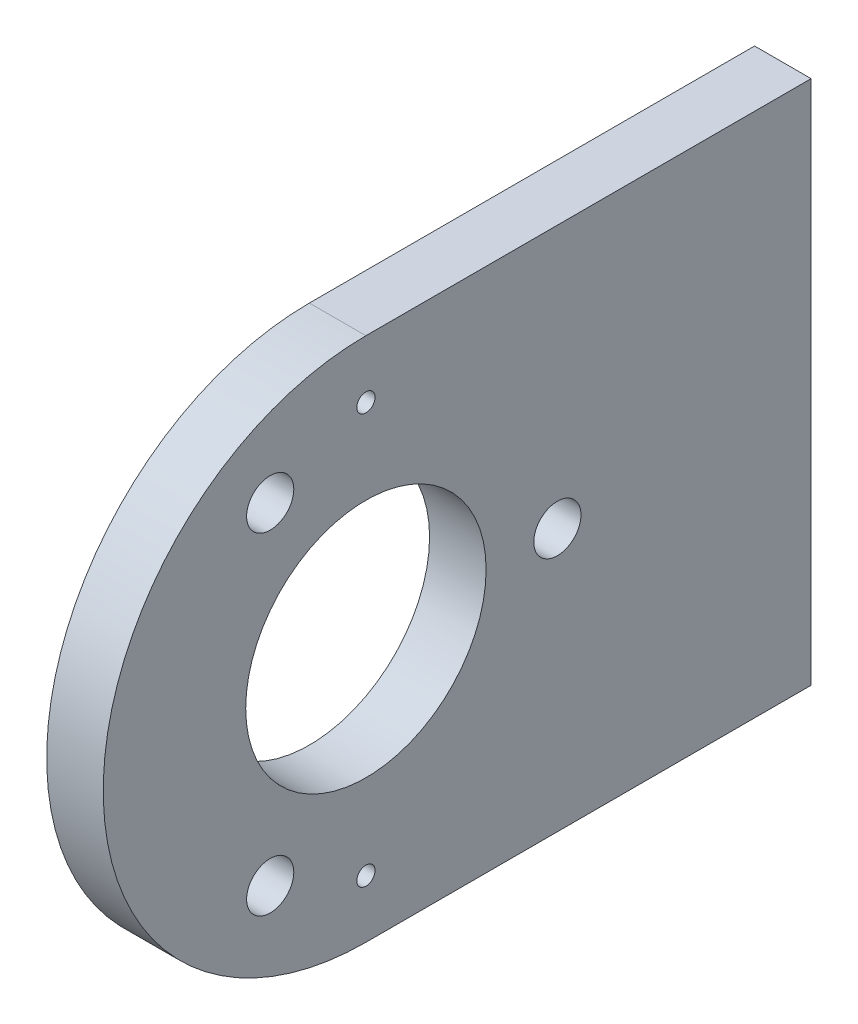
ISO-10303-21;
HEADER;
FILE_DESCRIPTION(('STEP AP214'),'2;1');
FILE_NAME('part.step','',(''),(''),'','','');
FILE_SCHEMA(('AUTOMOTIVE_DESIGN { 1 0 10303 214 1 1 1 1 }'));
ENDSEC;
DATA;
#1=APPLICATION_CONTEXT('core data for automotive mechanical design processes');
#2=APPLICATION_PROTOCOL_DEFINITION('international standard','automotive_design',2000,#1);
#3=PRODUCT_CONTEXT('',#1,'mechanical');
#4=PRODUCT('Part','Part','',(#3));
#5=PRODUCT_RELATED_PRODUCT_CATEGORY('part','',(#4));
#6=PRODUCT_DEFINITION_FORMATION('','',#4);
#7=PRODUCT_DEFINITION_CONTEXT('part definition',#1,'design');
#8=PRODUCT_DEFINITION('design','',#6,#7);
#9=PRODUCT_DEFINITION_SHAPE('','',#8);
#10=(LENGTH_UNIT() NAMED_UNIT(*) SI_UNIT(.MILLI.,.METRE.));
#11=(NAMED_UNIT(*) PLANE_ANGLE_UNIT() SI_UNIT($,.RADIAN.));
#12=(NAMED_UNIT(*) SI_UNIT($,.STERADIAN.) SOLID_ANGLE_UNIT());
#13=UNCERTAINTY_MEASURE_WITH_UNIT(LENGTH_MEASURE(1.E-05),#10,'distance_accuracy_value','');
#14=(GEOMETRIC_REPRESENTATION_CONTEXT(3) GLOBAL_UNCERTAINTY_ASSIGNED_CONTEXT((#13)) GLOBAL_UNIT_ASSIGNED_CONTEXT((#10,
#11,#12)) REPRESENTATION_CONTEXT('',''));
#15=CARTESIAN_POINT('',(0.,0.,0.));
#16=DIRECTION('',(0.,0.,1.));
#17=DIRECTION('',(1.,0.,0.));
#18=AXIS2_PLACEMENT_3D('',#15,#16,#17);
#19=CARTESIAN_POINT('',(6.35,29.5,0.));
#20=DIRECTION('',(0.,1.,0.));
#21=DIRECTION('',(0.,0.,1.));
#22=AXIS2_PLACEMENT_3D('',#19,#20,#21);
#23=PLANE('',#22);
#24=DIRECTION('',(0.,0.,-1.));
#25=VECTOR('',#24,1.);
#26=CARTESIAN_POINT('',(0.,29.5,0.));
#27=LINE('',#26,#25);
#28=CARTESIAN_POINT('',(0.,29.5,50.));
#29=VERTEX_POINT('',#28);
#30=CARTESIAN_POINT('',(0.,29.5,0.));
#31=VERTEX_POINT('',#30);
#32=EDGE_CURVE('E186',#29,#31,#27,.T.);
#33=ORIENTED_EDGE('',*,*,#32,.F.);
#34=DIRECTION('',(-1.,0.,0.));
#35=VECTOR('',#34,1.);
#36=CARTESIAN_POINT('',(6.35,29.5,50.));
#37=LINE('',#36,#35);
#38=CARTESIAN_POINT('',(6.35,29.5,50.));
#39=VERTEX_POINT('',#38);
#40=EDGE_CURVE('E11',#39,#29,#37,.T.);
#41=ORIENTED_EDGE('',*,*,#40,.F.);
#42=DIRECTION('',(0.,0.,-1.));
#43=VECTOR('',#42,1.);
#44=CARTESIAN_POINT('',(6.35,29.5,0.));
#45=LINE('',#44,#43);
#46=CARTESIAN_POINT('',(6.35,29.5,0.));
#47=VERTEX_POINT('',#46);
#48=EDGE_CURVE('E166',#39,#47,#45,.T.);
#49=ORIENTED_EDGE('',*,*,#48,.T.);
#50=DIRECTION('',(-1.,0.,0.));
#51=VECTOR('',#50,1.);
#52=CARTESIAN_POINT('',(6.35,29.5,0.));
#53=LINE('',#52,#51);
#54=EDGE_CURVE('E61',#47,#31,#53,.T.);
#55=ORIENTED_EDGE('',*,*,#54,.T.);
#56=EDGE_LOOP('',(#33,#41,#49,#55));
#57=FACE_BOUND('',#56,.T.);
#58=ADVANCED_FACE('F44',(#57),#23,.T.);
#59=CARTESIAN_POINT('',(6.35,0.,50.));
#60=DIRECTION('',(-1.,0.,0.));
#61=DIRECTION('',(0.,0.,1.));
#62=AXIS2_PLACEMENT_3D('',#59,#60,#61);
#63=CYLINDRICAL_SURFACE('',#62,29.5);
#64=CARTESIAN_POINT('',(0.,0.,50.));
#65=DIRECTION('',(1.,0.,0.));
#66=DIRECTION('',(0.,0.,-1.));
#67=AXIS2_PLACEMENT_3D('',#64,#65,#66);
#68=CIRCLE('',#67,29.5);
#69=CARTESIAN_POINT('',(0.,-29.5,50.));
#70=VERTEX_POINT('',#69);
#71=EDGE_CURVE('E188',#29,#70,#68,.T.);
#72=ORIENTED_EDGE('',*,*,#71,.T.);
#73=DIRECTION('',(-1.,0.,0.));
#74=VECTOR('',#73,1.);
#75=CARTESIAN_POINT('',(6.35,-29.5,50.));
#76=LINE('',#75,#74);
#77=CARTESIAN_POINT('',(6.35,-29.5,50.));
#78=VERTEX_POINT('',#77);
#79=EDGE_CURVE('E53',#78,#70,#76,.T.);
#80=ORIENTED_EDGE('',*,*,#79,.F.);
#81=CARTESIAN_POINT('',(6.35,0.,50.));
#82=DIRECTION('',(1.,0.,0.));
#83=DIRECTION('',(0.,0.,-1.));
#84=AXIS2_PLACEMENT_3D('',#81,#82,#83);
#85=CIRCLE('',#84,29.5);
#86=EDGE_CURVE('E168',#39,#78,#85,.T.);
#87=ORIENTED_EDGE('',*,*,#86,.F.);
#88=ORIENTED_EDGE('',*,*,#40,.T.);
#89=EDGE_LOOP('',(#72,#80,#87,#88));
#90=FACE_BOUND('',#89,.T.);
#91=ADVANCED_FACE('F202',(#90),#63,.T.);
#92=CARTESIAN_POINT('',(6.35,-29.5,0.));
#93=DIRECTION('',(0.,1.,0.));
#94=DIRECTION('',(0.,0.,1.));
#95=AXIS2_PLACEMENT_3D('',#92,#93,#94);
#96=PLANE('',#95);
#97=DIRECTION('',(0.,0.,-1.));
#98=VECTOR('',#97,1.);
#99=CARTESIAN_POINT('',(0.,-29.5,0.));
#100=LINE('',#99,#98);
#101=CARTESIAN_POINT('',(0.,-29.5,0.));
#102=VERTEX_POINT('',#101);
#103=EDGE_CURVE('E191',#70,#102,#100,.T.);
#104=ORIENTED_EDGE('',*,*,#103,.T.);
#105=DIRECTION('',(-1.,0.,0.));
#106=VECTOR('',#105,1.);
#107=CARTESIAN_POINT('',(6.35,-29.5,0.));
#108=LINE('',#107,#106);
#109=CARTESIAN_POINT('',(6.35,-29.5,0.));
#110=VERTEX_POINT('',#109);
#111=EDGE_CURVE('E76',#110,#102,#108,.T.);
#112=ORIENTED_EDGE('',*,*,#111,.F.);
#113=DIRECTION('',(0.,0.,-1.));
#114=VECTOR('',#113,1.);
#115=CARTESIAN_POINT('',(6.35,-29.5,0.));
#116=LINE('',#115,#114);
#117=EDGE_CURVE('E171',#78,#110,#116,.T.);
#118=ORIENTED_EDGE('',*,*,#117,.F.);
#119=ORIENTED_EDGE('',*,*,#79,.T.);
#120=EDGE_LOOP('',(#104,#112,#118,#119));
#121=FACE_BOUND('',#120,.T.);
#122=ADVANCED_FACE('F199',(#121),#96,.F.);
#123=CARTESIAN_POINT('',(6.35,0.,50.));
#124=DIRECTION('',(-1.,0.,0.));
#125=DIRECTION('',(0.,0.,1.));
#126=AXIS2_PLACEMENT_3D('',#123,#124,#125);
#127=CYLINDRICAL_SURFACE('',#126,13.5);
#128=CARTESIAN_POINT('',(6.35,0.,50.));
#129=DIRECTION('',(1.,0.,0.));
#130=DIRECTION('',(0.,0.,-1.));
#131=AXIS2_PLACEMENT_3D('',#128,#129,#130);
#132=CIRCLE('',#131,13.5);
#133=CARTESIAN_POINT('',(6.35,0.,36.5));
#134=VERTEX_POINT('',#133);
#135=EDGE_CURVE('E163',#134,#134,#132,.T.);
#136=ORIENTED_EDGE('',*,*,#135,.T.);
#137=EDGE_LOOP('',(#136));
#138=FACE_BOUND('',#137,.T.);
#139=CARTESIAN_POINT('',(0.,0.,50.));
#140=DIRECTION('',(1.,0.,0.));
#141=DIRECTION('',(0.,0.,-1.));
#142=AXIS2_PLACEMENT_3D('',#139,#140,#141);
#143=CIRCLE('',#142,13.5);
#144=CARTESIAN_POINT('',(0.,0.,36.5));
#145=VERTEX_POINT('',#144);
#146=EDGE_CURVE('E183',#145,#145,#143,.T.);
#147=ORIENTED_EDGE('',*,*,#146,.F.);
#148=EDGE_LOOP('',(#147));
#149=FACE_BOUND('',#148,.T.);
#150=ADVANCED_FACE('F213',(#138,#149),#127,.F.);
#151=CARTESIAN_POINT('',(6.35,18.6195461813654,60.75));
#152=DIRECTION('',(-1.,0.,0.));
#153=DIRECTION('',(0.,0.,1.));
#154=AXIS2_PLACEMENT_3D('',#151,#152,#153);
#155=CYLINDRICAL_SURFACE('',#154,2.65000000000004);
#156=CARTESIAN_POINT('',(6.35,18.6195461813654,60.75));
#157=DIRECTION('',(1.,0.,0.));
#158=DIRECTION('',(0.,0.,-1.));
#159=AXIS2_PLACEMENT_3D('',#156,#157,#158);
#160=CIRCLE('',#159,2.65000000000004);
#161=CARTESIAN_POINT('',(6.35,18.6195461813654,58.0999999999999));
#162=VERTEX_POINT('',#161);
#163=EDGE_CURVE('E160',#162,#162,#160,.T.);
#164=ORIENTED_EDGE('',*,*,#163,.T.);
#165=EDGE_LOOP('',(#164));
#166=FACE_BOUND('',#165,.T.);
#167=CARTESIAN_POINT('',(0.,18.6195461813654,60.75));
#168=DIRECTION('',(1.,0.,0.));
#169=DIRECTION('',(0.,0.,-1.));
#170=AXIS2_PLACEMENT_3D('',#167,#168,#169);
#171=CIRCLE('',#170,2.65000000000004);
#172=CARTESIAN_POINT('',(0.,18.6195461813654,58.0999999999999));
#173=VERTEX_POINT('',#172);
#174=EDGE_CURVE('E180',#173,#173,#171,.T.);
#175=ORIENTED_EDGE('',*,*,#174,.F.);
#176=EDGE_LOOP('',(#175));
#177=FACE_BOUND('',#176,.T.);
#178=ADVANCED_FACE('F216',(#166,#177),#155,.F.);
#179=CARTESIAN_POINT('',(6.35,0.,28.5));
#180=DIRECTION('',(-1.,0.,0.));
#181=DIRECTION('',(0.,0.,1.));
#182=AXIS2_PLACEMENT_3D('',#179,#180,#181);
#183=CYLINDRICAL_SURFACE('',#182,2.65000000000003);
#184=CARTESIAN_POINT('',(6.35,0.,28.5));
#185=DIRECTION('',(1.,0.,0.));
#186=DIRECTION('',(0.,0.,-1.));
#187=AXIS2_PLACEMENT_3D('',#184,#185,#186);
#188=CIRCLE('',#187,2.65000000000003);
#189=CARTESIAN_POINT('',(6.35,0.,25.85));
#190=VERTEX_POINT('',#189);
#191=EDGE_CURVE('E156',#190,#190,#188,.T.);
#192=ORIENTED_EDGE('',*,*,#191,.T.);
#193=EDGE_LOOP('',(#192));
#194=FACE_BOUND('',#193,.T.);
#195=CARTESIAN_POINT('',(0.,0.,28.5));
#196=DIRECTION('',(1.,0.,0.));
#197=DIRECTION('',(0.,0.,-1.));
#198=AXIS2_PLACEMENT_3D('',#195,#196,#197);
#199=CIRCLE('',#198,2.65000000000003);
#200=CARTESIAN_POINT('',(0.,0.,25.85));
#201=VERTEX_POINT('',#200);
#202=EDGE_CURVE('E177',#201,#201,#199,.T.);
#203=ORIENTED_EDGE('',*,*,#202,.F.);
#204=EDGE_LOOP('',(#203));
#205=FACE_BOUND('',#204,.T.);
#206=ADVANCED_FACE('F219',(#194,#205),#183,.F.);
#207=CARTESIAN_POINT('',(6.35,-18.6195461813654,60.7499999999999));
#208=DIRECTION('',(-1.,0.,0.));
#209=DIRECTION('',(0.,0.,1.));
#210=AXIS2_PLACEMENT_3D('',#207,#208,#209);
#211=CYLINDRICAL_SURFACE('',#210,2.65000000000004);
#212=CARTESIAN_POINT('',(6.35,-18.6195461813654,60.7499999999999));
#213=DIRECTION('',(1.,0.,0.));
#214=DIRECTION('',(0.,0.,-1.));
#215=AXIS2_PLACEMENT_3D('',#212,#213,#214);
#216=CIRCLE('',#215,2.65000000000004);
#217=CARTESIAN_POINT('',(6.35,-18.6195461813654,58.0999999999999));
#218=VERTEX_POINT('',#217);
#219=EDGE_CURVE('E153',#218,#218,#216,.T.);
#220=ORIENTED_EDGE('',*,*,#219,.T.);
#221=EDGE_LOOP('',(#220));
#222=FACE_BOUND('',#221,.T.);
#223=CARTESIAN_POINT('',(0.,-18.6195461813654,60.7499999999999));
#224=DIRECTION('',(1.,0.,0.));
#225=DIRECTION('',(0.,0.,-1.));
#226=AXIS2_PLACEMENT_3D('',#223,#224,#225);
#227=CIRCLE('',#226,2.65000000000004);
#228=CARTESIAN_POINT('',(0.,-18.6195461813654,58.0999999999999));
#229=VERTEX_POINT('',#228);
#230=EDGE_CURVE('E152',#229,#229,#227,.T.);
#231=ORIENTED_EDGE('',*,*,#230,.F.);
#232=EDGE_LOOP('',(#231));
#233=FACE_BOUND('',#232,.T.);
#234=ADVANCED_FACE('F46',(#222,#233),#211,.F.);
#235=CARTESIAN_POINT('',(6.35,0.,0.));
#236=DIRECTION('',(0.,0.,-1.));
#237=DIRECTION('',(-1.,0.,0.));
#238=AXIS2_PLACEMENT_3D('',#235,#236,#237);
#239=PLANE('',#238);
#240=CARTESIAN_POINT('',(3.175,0.,0.));
#241=DIRECTION('',(0.,0.,-1.));
#242=DIRECTION('',(-1.,0.,0.));
#243=AXIS2_PLACEMENT_3D('',#240,#241,#242);
#244=CIRCLE('',#243,1.02499999999999);
#245=CARTESIAN_POINT('',(2.15000000000001,0.,0.));
#246=VERTEX_POINT('',#245);
#247=EDGE_CURVE('E112',#246,#246,#244,.T.);
#248=ORIENTED_EDGE('',*,*,#247,.F.);
#249=EDGE_LOOP('',(#248));
#250=FACE_BOUND('',#249,.T.);
#251=CARTESIAN_POINT('',(3.175,12.75,0.));
#252=DIRECTION('',(0.,0.,-1.));
#253=DIRECTION('',(-1.,0.,0.));
#254=AXIS2_PLACEMENT_3D('',#251,#252,#253);
#255=CIRCLE('',#254,1.02499999999999);
#256=CARTESIAN_POINT('',(2.15000000000001,12.75,0.));
#257=VERTEX_POINT('',#256);
#258=EDGE_CURVE('E111',#257,#257,#255,.T.);
#259=ORIENTED_EDGE('',*,*,#258,.F.);
#260=EDGE_LOOP('',(#259));
#261=FACE_BOUND('',#260,.T.);
#262=CARTESIAN_POINT('',(3.175,25.5,0.));
#263=DIRECTION('',(0.,0.,-1.));
#264=DIRECTION('',(-1.,0.,0.));
#265=AXIS2_PLACEMENT_3D('',#262,#263,#264);
#266=CIRCLE('',#265,1.02499999999999);
#267=CARTESIAN_POINT('',(2.15000000000001,25.5,0.));
#268=VERTEX_POINT('',#267);
#269=EDGE_CURVE('E122',#268,#268,#266,.T.);
#270=ORIENTED_EDGE('',*,*,#269,.F.);
#271=EDGE_LOOP('',(#270));
#272=FACE_BOUND('',#271,.T.);
#273=CARTESIAN_POINT('',(3.175,-12.75,0.));
#274=DIRECTION('',(0.,0.,-1.));
#275=DIRECTION('',(-1.,0.,0.));
#276=AXIS2_PLACEMENT_3D('',#273,#274,#275);
#277=CIRCLE('',#276,1.02499999999999);
#278=CARTESIAN_POINT('',(2.15000000000001,-12.75,0.));
#279=VERTEX_POINT('',#278);
#280=EDGE_CURVE('E128',#279,#279,#277,.T.);
#281=ORIENTED_EDGE('',*,*,#280,.F.);
#282=EDGE_LOOP('',(#281));
#283=FACE_BOUND('',#282,.T.);
#284=CARTESIAN_POINT('',(3.175,-25.5,0.));
#285=DIRECTION('',(0.,0.,-1.));
#286=DIRECTION('',(-1.,0.,0.));
#287=AXIS2_PLACEMENT_3D('',#284,#285,#286);
#288=CIRCLE('',#287,1.02499999999999);
#289=CARTESIAN_POINT('',(2.15000000000001,-25.5,0.));
#290=VERTEX_POINT('',#289);
#291=EDGE_CURVE('E134',#290,#290,#288,.T.);
#292=ORIENTED_EDGE('',*,*,#291,.F.);
#293=EDGE_LOOP('',(#292));
#294=FACE_BOUND('',#293,.T.);
#295=DIRECTION('',(0.,-1.,0.));
#296=VECTOR('',#295,1.);
#297=CARTESIAN_POINT('',(0.,0.,0.));
#298=LINE('',#297,#296);
#299=EDGE_CURVE('E157',#31,#102,#298,.T.);
#300=ORIENTED_EDGE('',*,*,#299,.F.);
#301=ORIENTED_EDGE('',*,*,#54,.F.);
#302=DIRECTION('',(0.,-1.,0.));
#303=VECTOR('',#302,1.);
#304=CARTESIAN_POINT('',(6.35,0.,0.));
#305=LINE('',#304,#303);
#306=EDGE_CURVE('E173',#47,#110,#305,.T.);
#307=ORIENTED_EDGE('',*,*,#306,.T.);
#308=ORIENTED_EDGE('',*,*,#111,.T.);
#309=EDGE_LOOP('',(#300,#301,#307,#308));
#310=FACE_BOUND('',#309,.T.);
#311=ADVANCED_FACE('F226',(#250,#261,#272,#283,#294,#310),#239,.T.);
#312=CARTESIAN_POINT('',(6.35,0.,0.));
#313=DIRECTION('',(1.,0.,0.));
#314=DIRECTION('',(0.,0.,-1.));
#315=AXIS2_PLACEMENT_3D('',#312,#313,#314);
#316=PLANE('',#315);
#317=CARTESIAN_POINT('',(6.35,23.015,50.));
#318=DIRECTION('',(1.,0.,0.));
#319=DIRECTION('',(0.,0.,-1.));
#320=AXIS2_PLACEMENT_3D('',#317,#318,#319);
#321=CIRCLE('',#320,1.02499999999999);
#322=CARTESIAN_POINT('',(6.35,23.015,48.975));
#323=VERTEX_POINT('',#322);
#324=EDGE_CURVE('E140',#323,#323,#321,.T.);
#325=ORIENTED_EDGE('',*,*,#324,.F.);
#326=EDGE_LOOP('',(#325));
#327=FACE_BOUND('',#326,.T.);
#328=CARTESIAN_POINT('',(6.35,-23.015,50.));
#329=DIRECTION('',(1.,0.,0.));
#330=DIRECTION('',(0.,0.,-1.));
#331=AXIS2_PLACEMENT_3D('',#328,#329,#330);
#332=CIRCLE('',#331,1.02499999999999);
#333=CARTESIAN_POINT('',(6.35,-23.015,48.975));
#334=VERTEX_POINT('',#333);
#335=EDGE_CURVE('E146',#334,#334,#332,.T.);
#336=ORIENTED_EDGE('',*,*,#335,.F.);
#337=EDGE_LOOP('',(#336));
#338=FACE_BOUND('',#337,.T.);
#339=ORIENTED_EDGE('',*,*,#219,.F.);
#340=EDGE_LOOP('',(#339));
#341=FACE_BOUND('',#340,.T.);
#342=ORIENTED_EDGE('',*,*,#191,.F.);
#343=EDGE_LOOP('',(#342));
#344=FACE_BOUND('',#343,.T.);
#345=ORIENTED_EDGE('',*,*,#163,.F.);
#346=EDGE_LOOP('',(#345));
#347=FACE_BOUND('',#346,.T.);
#348=ORIENTED_EDGE('',*,*,#135,.F.);
#349=EDGE_LOOP('',(#348));
#350=FACE_BOUND('',#349,.T.);
#351=ORIENTED_EDGE('',*,*,#48,.F.);
#352=ORIENTED_EDGE('',*,*,#86,.T.);
#353=ORIENTED_EDGE('',*,*,#117,.T.);
#354=ORIENTED_EDGE('',*,*,#306,.F.);
#355=EDGE_LOOP('',(#351,#352,#353,#354));
#356=FACE_BOUND('',#355,.T.);
#357=ADVANCED_FACE('F235',(#327,#338,#341,#344,#347,#350,#356),#316,.T.);
#358=CARTESIAN_POINT('',(0.,0.,0.));
#359=DIRECTION('',(1.,0.,0.));
#360=DIRECTION('',(0.,0.,-1.));
#361=AXIS2_PLACEMENT_3D('',#358,#359,#360);
#362=PLANE('',#361);
#363=CARTESIAN_POINT('',(0.,23.015,50.));
#364=DIRECTION('',(1.,0.,0.));
#365=DIRECTION('',(0.,0.,-1.));
#366=AXIS2_PLACEMENT_3D('',#363,#364,#365);
#367=CIRCLE('',#366,1.02499999999999);
#368=CARTESIAN_POINT('',(0.,23.015,48.975));
#369=VERTEX_POINT('',#368);
#370=EDGE_CURVE('E143',#369,#369,#367,.T.);
#371=ORIENTED_EDGE('',*,*,#370,.T.);
#372=EDGE_LOOP('',(#371));
#373=FACE_BOUND('',#372,.T.);
#374=CARTESIAN_POINT('',(0.,-23.015,50.));
#375=DIRECTION('',(1.,0.,0.));
#376=DIRECTION('',(0.,0.,-1.));
#377=AXIS2_PLACEMENT_3D('',#374,#375,#376);
#378=CIRCLE('',#377,1.02499999999999);
#379=CARTESIAN_POINT('',(0.,-23.015,48.975));
#380=VERTEX_POINT('',#379);
#381=EDGE_CURVE('E149',#380,#380,#378,.T.);
#382=ORIENTED_EDGE('',*,*,#381,.T.);
#383=EDGE_LOOP('',(#382));
#384=FACE_BOUND('',#383,.T.);
#385=ORIENTED_EDGE('',*,*,#230,.T.);
#386=EDGE_LOOP('',(#385));
#387=FACE_BOUND('',#386,.T.);
#388=ORIENTED_EDGE('',*,*,#202,.T.);
#389=EDGE_LOOP('',(#388));
#390=FACE_BOUND('',#389,.T.);
#391=ORIENTED_EDGE('',*,*,#174,.T.);
#392=EDGE_LOOP('',(#391));
#393=FACE_BOUND('',#392,.T.);
#394=ORIENTED_EDGE('',*,*,#146,.T.);
#395=EDGE_LOOP('',(#394));
#396=FACE_BOUND('',#395,.T.);
#397=ORIENTED_EDGE('',*,*,#32,.T.);
#398=ORIENTED_EDGE('',*,*,#299,.T.);
#399=ORIENTED_EDGE('',*,*,#103,.F.);
#400=ORIENTED_EDGE('',*,*,#71,.F.);
#401=EDGE_LOOP('',(#397,#398,#399,#400));
#402=FACE_BOUND('',#401,.T.);
#403=ADVANCED_FACE('F204',(#373,#384,#387,#390,#393,#396,#402),#362,.F.);
#404=CARTESIAN_POINT('',(6.35,-23.015,50.));
#405=DIRECTION('',(1.,0.,0.));
#406=DIRECTION('',(0.,0.,-1.));
#407=AXIS2_PLACEMENT_3D('',#404,#405,#406);
#408=CYLINDRICAL_SURFACE('',#407,1.02499999999999);
#409=ORIENTED_EDGE('',*,*,#381,.F.);
#410=EDGE_LOOP('',(#409));
#411=FACE_BOUND('',#410,.T.);
#412=ORIENTED_EDGE('',*,*,#335,.T.);
#413=EDGE_LOOP('',(#412));
#414=FACE_BOUND('',#413,.T.);
#415=ADVANCED_FACE('F234',(#411,#414),#408,.F.);
#416=CARTESIAN_POINT('',(6.35,23.015,50.));
#417=DIRECTION('',(1.,0.,0.));
#418=DIRECTION('',(0.,0.,-1.));
#419=AXIS2_PLACEMENT_3D('',#416,#417,#418);
#420=CYLINDRICAL_SURFACE('',#419,1.02499999999999);
#421=ORIENTED_EDGE('',*,*,#370,.F.);
#422=EDGE_LOOP('',(#421));
#423=FACE_BOUND('',#422,.T.);
#424=ORIENTED_EDGE('',*,*,#324,.T.);
#425=EDGE_LOOP('',(#424));
#426=FACE_BOUND('',#425,.T.);
#427=ADVANCED_FACE('F247',(#423,#426),#420,.F.);
#428=CARTESIAN_POINT('',(3.175,-25.5,6.35));
#429=DIRECTION('',(0.,0.,-1.));
#430=DIRECTION('',(-1.,0.,0.));
#431=AXIS2_PLACEMENT_3D('',#428,#429,#430);
#432=CONICAL_SURFACE('',#431,1.025,1.02974425867665);
#433=CARTESIAN_POINT('',(3.175,-25.5,6.96588213450325));
#434=VERTEX_POINT('',#433);
#435=VERTEX_LOOP('',#434);
#436=FACE_BOUND('',#435,.T.);
#437=CARTESIAN_POINT('',(3.175,-25.5,6.35));
#438=DIRECTION('',(0.,0.,-1.));
#439=DIRECTION('',(-1.,0.,0.));
#440=AXIS2_PLACEMENT_3D('',#437,#438,#439);
#441=CIRCLE('',#440,1.025);
#442=CARTESIAN_POINT('',(2.15,-25.5,6.35));
#443=VERTEX_POINT('',#442);
#444=EDGE_CURVE('E137',#443,#443,#441,.T.);
#445=ORIENTED_EDGE('',*,*,#444,.T.);
#446=EDGE_LOOP('',(#445));
#447=FACE_BOUND('',#446,.T.);
#448=ADVANCED_FACE('F313',(#436,#447),#432,.F.);
#449=CARTESIAN_POINT('',(3.175,-25.5,0.));
#450=DIRECTION('',(0.,0.,-1.));
#451=DIRECTION('',(-1.,0.,0.));
#452=AXIS2_PLACEMENT_3D('',#449,#450,#451);
#453=CYLINDRICAL_SURFACE('',#452,1.02499999999999);
#454=ORIENTED_EDGE('',*,*,#444,.F.);
#455=EDGE_LOOP('',(#454));
#456=FACE_BOUND('',#455,.T.);
#457=ORIENTED_EDGE('',*,*,#291,.T.);
#458=EDGE_LOOP('',(#457));
#459=FACE_BOUND('',#458,.T.);
#460=ADVANCED_FACE('F334',(#456,#459),#453,.F.);
#461=CARTESIAN_POINT('',(3.175,-12.75,6.35));
#462=DIRECTION('',(0.,0.,-1.));
#463=DIRECTION('',(-1.,0.,0.));
#464=AXIS2_PLACEMENT_3D('',#461,#462,#463);
#465=CONICAL_SURFACE('',#464,1.025,1.02974425867665);
#466=CARTESIAN_POINT('',(3.175,-12.75,6.96588213450325));
#467=VERTEX_POINT('',#466);
#468=VERTEX_LOOP('',#467);
#469=FACE_BOUND('',#468,.T.);
#470=CARTESIAN_POINT('',(3.175,-12.75,6.35));
#471=DIRECTION('',(0.,0.,-1.));
#472=DIRECTION('',(-1.,0.,0.));
#473=AXIS2_PLACEMENT_3D('',#470,#471,#472);
#474=CIRCLE('',#473,1.025);
#475=CARTESIAN_POINT('',(2.15,-12.75,6.35));
#476=VERTEX_POINT('',#475);
#477=EDGE_CURVE('E131',#476,#476,#474,.T.);
#478=ORIENTED_EDGE('',*,*,#477,.T.);
#479=EDGE_LOOP('',(#478));
#480=FACE_BOUND('',#479,.T.);
#481=ADVANCED_FACE('F344',(#469,#480),#465,.F.);
#482=CARTESIAN_POINT('',(3.175,-12.75,0.));
#483=DIRECTION('',(0.,0.,-1.));
#484=DIRECTION('',(-1.,0.,0.));
#485=AXIS2_PLACEMENT_3D('',#482,#483,#484);
#486=CYLINDRICAL_SURFACE('',#485,1.02499999999999);
#487=ORIENTED_EDGE('',*,*,#477,.F.);
#488=EDGE_LOOP('',(#487));
#489=FACE_BOUND('',#488,.T.);
#490=ORIENTED_EDGE('',*,*,#280,.T.);
#491=EDGE_LOOP('',(#490));
#492=FACE_BOUND('',#491,.T.);
#493=ADVANCED_FACE('F355',(#489,#492),#486,.F.);
#494=CARTESIAN_POINT('',(3.175,25.5,6.35));
#495=DIRECTION('',(0.,0.,-1.));
#496=DIRECTION('',(-1.,0.,0.));
#497=AXIS2_PLACEMENT_3D('',#494,#495,#496);
#498=CONICAL_SURFACE('',#497,1.025,1.02974425867665);
#499=CARTESIAN_POINT('',(3.175,25.5,6.96588213450325));
#500=VERTEX_POINT('',#499);
#501=VERTEX_LOOP('',#500);
#502=FACE_BOUND('',#501,.T.);
#503=CARTESIAN_POINT('',(3.175,25.5,6.35));
#504=DIRECTION('',(0.,0.,-1.));
#505=DIRECTION('',(-1.,0.,0.));
#506=AXIS2_PLACEMENT_3D('',#503,#504,#505);
#507=CIRCLE('',#506,1.025);
#508=CARTESIAN_POINT('',(2.15,25.5,6.35));
#509=VERTEX_POINT('',#508);
#510=EDGE_CURVE('E125',#509,#509,#507,.T.);
#511=ORIENTED_EDGE('',*,*,#510,.T.);
#512=EDGE_LOOP('',(#511));
#513=FACE_BOUND('',#512,.T.);
#514=ADVANCED_FACE('F365',(#502,#513),#498,.F.);
#515=CARTESIAN_POINT('',(3.175,25.5,0.));
#516=DIRECTION('',(0.,0.,-1.));
#517=DIRECTION('',(-1.,0.,0.));
#518=AXIS2_PLACEMENT_3D('',#515,#516,#517);
#519=CYLINDRICAL_SURFACE('',#518,1.02499999999999);
#520=ORIENTED_EDGE('',*,*,#510,.F.);
#521=EDGE_LOOP('',(#520));
#522=FACE_BOUND('',#521,.T.);
#523=ORIENTED_EDGE('',*,*,#269,.T.);
#524=EDGE_LOOP('',(#523));
#525=FACE_BOUND('',#524,.T.);
#526=ADVANCED_FACE('F376',(#522,#525),#519,.F.);
#527=CARTESIAN_POINT('',(3.175,12.75,6.35));
#528=DIRECTION('',(0.,0.,-1.));
#529=DIRECTION('',(-1.,0.,0.));
#530=AXIS2_PLACEMENT_3D('',#527,#528,#529);
#531=CONICAL_SURFACE('',#530,1.025,1.02974425867665);
#532=CARTESIAN_POINT('',(3.175,12.75,6.96588213450325));
#533=VERTEX_POINT('',#532);
#534=VERTEX_LOOP('',#533);
#535=FACE_BOUND('',#534,.T.);
#536=CARTESIAN_POINT('',(3.175,12.75,6.35));
#537=DIRECTION('',(0.,0.,-1.));
#538=DIRECTION('',(-1.,0.,0.));
#539=AXIS2_PLACEMENT_3D('',#536,#537,#538);
#540=CIRCLE('',#539,1.025);
#541=CARTESIAN_POINT('',(2.15,12.75,6.35));
#542=VERTEX_POINT('',#541);
#543=EDGE_CURVE('E115',#542,#542,#540,.T.);
#544=ORIENTED_EDGE('',*,*,#543,.T.);
#545=EDGE_LOOP('',(#544));
#546=FACE_BOUND('',#545,.T.);
#547=ADVANCED_FACE('F386',(#535,#546),#531,.F.);
#548=CARTESIAN_POINT('',(3.175,12.75,0.));
#549=DIRECTION('',(0.,0.,-1.));
#550=DIRECTION('',(-1.,0.,0.));
#551=AXIS2_PLACEMENT_3D('',#548,#549,#550);
#552=CYLINDRICAL_SURFACE('',#551,1.02499999999999);
#553=ORIENTED_EDGE('',*,*,#543,.F.);
#554=EDGE_LOOP('',(#553));
#555=FACE_BOUND('',#554,.T.);
#556=ORIENTED_EDGE('',*,*,#258,.T.);
#557=EDGE_LOOP('',(#556));
#558=FACE_BOUND('',#557,.T.);
#559=ADVANCED_FACE('F105',(#555,#558),#552,.F.);
#560=CARTESIAN_POINT('',(3.175,0.,6.35));
#561=DIRECTION('',(0.,0.,-1.));
#562=DIRECTION('',(-1.,0.,0.));
#563=AXIS2_PLACEMENT_3D('',#560,#561,#562);
#564=CONICAL_SURFACE('',#563,1.025,1.02974425867665);
#565=CARTESIAN_POINT('',(3.175,0.,6.96588213450325));
#566=VERTEX_POINT('',#565);
#567=VERTEX_LOOP('',#566);
#568=FACE_BOUND('',#567,.T.);
#569=CARTESIAN_POINT('',(3.175,0.,6.35));
#570=DIRECTION('',(0.,0.,-1.));
#571=DIRECTION('',(-1.,0.,0.));
#572=AXIS2_PLACEMENT_3D('',#569,#570,#571);
#573=CIRCLE('',#572,1.025);
#574=CARTESIAN_POINT('',(2.15,0.,6.35));
#575=VERTEX_POINT('',#574);
#576=EDGE_CURVE('E109',#575,#575,#573,.T.);
#577=ORIENTED_EDGE('',*,*,#576,.T.);
#578=EDGE_LOOP('',(#577));
#579=FACE_BOUND('',#578,.T.);
#580=ADVANCED_FACE('F101',(#568,#579),#564,.F.);
#581=CARTESIAN_POINT('',(3.175,0.,0.));
#582=DIRECTION('',(0.,0.,-1.));
#583=DIRECTION('',(-1.,0.,0.));
#584=AXIS2_PLACEMENT_3D('',#581,#582,#583);
#585=CYLINDRICAL_SURFACE('',#584,1.02499999999999);
#586=ORIENTED_EDGE('',*,*,#576,.F.);
#587=EDGE_LOOP('',(#586));
#588=FACE_BOUND('',#587,.T.);
#589=ORIENTED_EDGE('',*,*,#247,.T.);
#590=EDGE_LOOP('',(#589));
#591=FACE_BOUND('',#590,.T.);
#592=ADVANCED_FACE('F104',(#588,#591),#585,.F.);
#593=CLOSED_SHELL('',(#58,#91,#122,#150,#178,#206,#234,#311,#357,#403,#415,#427,#448,#460,#481,
#493,#514,#526,#547,#559,#580,#592));
#594=MANIFOLD_SOLID_BREP('B2',#593);
#595=ADVANCED_BREP_SHAPE_REPRESENTATION('',(#18,#594),#14);
#596=SHAPE_DEFINITION_REPRESENTATION(#9,#595);
ENDSEC;
END-ISO-10303-21;
